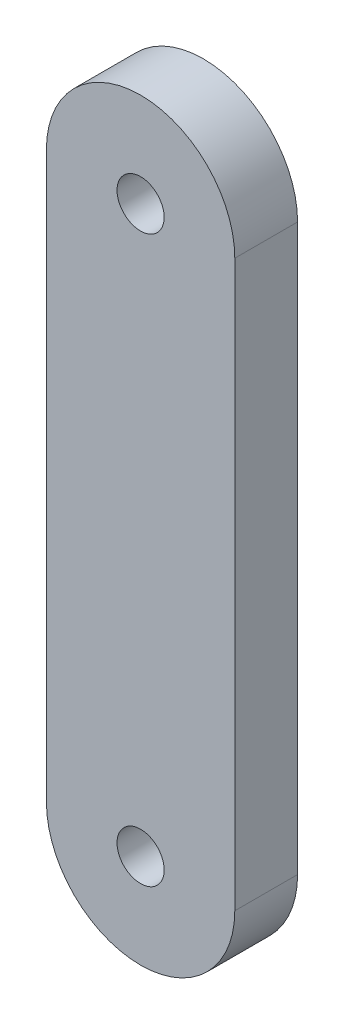
ISO-10303-21;
HEADER;
FILE_DESCRIPTION(('STEP AP214'),'2;1');
FILE_NAME('part.step','',(''),(''),'','','');
FILE_SCHEMA(('AUTOMOTIVE_DESIGN { 1 0 10303 214 1 1 1 1 }'));
ENDSEC;
DATA;
#1=APPLICATION_CONTEXT('core data for automotive mechanical design processes');
#2=APPLICATION_PROTOCOL_DEFINITION('international standard','automotive_design',2000,#1);
#3=PRODUCT_CONTEXT('',#1,'mechanical');
#4=PRODUCT('Part','Part','',(#3));
#5=PRODUCT_RELATED_PRODUCT_CATEGORY('part','',(#4));
#6=PRODUCT_DEFINITION_FORMATION('','',#4);
#7=PRODUCT_DEFINITION_CONTEXT('part definition',#1,'design');
#8=PRODUCT_DEFINITION('design','',#6,#7);
#9=PRODUCT_DEFINITION_SHAPE('','',#8);
#10=(LENGTH_UNIT() NAMED_UNIT(*) SI_UNIT(.MILLI.,.METRE.));
#11=(NAMED_UNIT(*) PLANE_ANGLE_UNIT() SI_UNIT($,.RADIAN.));
#12=(NAMED_UNIT(*) SI_UNIT($,.STERADIAN.) SOLID_ANGLE_UNIT());
#13=UNCERTAINTY_MEASURE_WITH_UNIT(LENGTH_MEASURE(1.E-05),#10,'distance_accuracy_value','');
#14=(GEOMETRIC_REPRESENTATION_CONTEXT(3) GLOBAL_UNCERTAINTY_ASSIGNED_CONTEXT((#13)) GLOBAL_UNIT_ASSIGNED_CONTEXT((#10,
#11,#12)) REPRESENTATION_CONTEXT('',''));
#15=CARTESIAN_POINT('',(0.,0.,0.));
#16=DIRECTION('',(0.,0.,1.));
#17=DIRECTION('',(1.,0.,0.));
#18=AXIS2_PLACEMENT_3D('',#15,#16,#17);
#19=CARTESIAN_POINT('',(0.,-36.,0.));
#20=DIRECTION('',(0.,0.,1.));
#21=DIRECTION('',(1.,0.,0.));
#22=AXIS2_PLACEMENT_3D('',#19,#20,#21);
#23=CYLINDRICAL_SURFACE('',#22,12.);
#24=CARTESIAN_POINT('',(0.,-36.,8.));
#25=DIRECTION('',(0.,0.,1.));
#26=DIRECTION('',(1.,0.,0.));
#27=AXIS2_PLACEMENT_3D('',#24,#25,#26);
#28=CIRCLE('',#27,12.);
#29=CARTESIAN_POINT('',(-12.,-36.,8.));
#30=VERTEX_POINT('',#29);
#31=CARTESIAN_POINT('',(12.,-36.,8.));
#32=VERTEX_POINT('',#31);
#33=EDGE_CURVE('E110',#30,#32,#28,.T.);
#34=ORIENTED_EDGE('',*,*,#33,.F.);
#35=DIRECTION('',(0.,0.,1.));
#36=VECTOR('',#35,1.);
#37=CARTESIAN_POINT('',(-12.,-36.,0.));
#38=LINE('',#37,#36);
#39=CARTESIAN_POINT('',(-12.,-36.,0.));
#40=VERTEX_POINT('',#39);
#41=EDGE_CURVE('E11',#40,#30,#38,.T.);
#42=ORIENTED_EDGE('',*,*,#41,.F.);
#43=CARTESIAN_POINT('',(0.,-36.,0.));
#44=DIRECTION('',(0.,0.,1.));
#45=DIRECTION('',(1.,0.,0.));
#46=AXIS2_PLACEMENT_3D('',#43,#44,#45);
#47=CIRCLE('',#46,12.);
#48=CARTESIAN_POINT('',(12.,-36.,0.));
#49=VERTEX_POINT('',#48);
#50=EDGE_CURVE('E101',#40,#49,#47,.T.);
#51=ORIENTED_EDGE('',*,*,#50,.T.);
#52=DIRECTION('',(0.,0.,1.));
#53=VECTOR('',#52,1.);
#54=CARTESIAN_POINT('',(12.,-36.,0.));
#55=LINE('',#54,#53);
#56=EDGE_CURVE('E42',#49,#32,#55,.T.);
#57=ORIENTED_EDGE('',*,*,#56,.T.);
#58=EDGE_LOOP('',(#34,#42,#51,#57));
#59=FACE_BOUND('',#58,.T.);
#60=ADVANCED_FACE('F39',(#59),#23,.T.);
#61=CARTESIAN_POINT('',(-12.,36.,0.));
#62=DIRECTION('',(-1.,0.,0.));
#63=DIRECTION('',(0.,0.,1.));
#64=AXIS2_PLACEMENT_3D('',#61,#62,#63);
#65=PLANE('',#64);
#66=DIRECTION('',(0.,-1.,0.));
#67=VECTOR('',#66,1.);
#68=CARTESIAN_POINT('',(-12.,36.,8.));
#69=LINE('',#68,#67);
#70=CARTESIAN_POINT('',(-12.,36.,8.));
#71=VERTEX_POINT('',#70);
#72=EDGE_CURVE('E104',#71,#30,#69,.T.);
#73=ORIENTED_EDGE('',*,*,#72,.F.);
#74=DIRECTION('',(0.,0.,1.));
#75=VECTOR('',#74,1.);
#76=CARTESIAN_POINT('',(-12.,36.,0.));
#77=LINE('',#76,#75);
#78=CARTESIAN_POINT('',(-12.,36.,0.));
#79=VERTEX_POINT('',#78);
#80=EDGE_CURVE('E49',#79,#71,#77,.T.);
#81=ORIENTED_EDGE('',*,*,#80,.F.);
#82=DIRECTION('',(0.,-1.,0.));
#83=VECTOR('',#82,1.);
#84=CARTESIAN_POINT('',(-12.,36.,0.));
#85=LINE('',#84,#83);
#86=EDGE_CURVE('E96',#79,#40,#85,.T.);
#87=ORIENTED_EDGE('',*,*,#86,.T.);
#88=ORIENTED_EDGE('',*,*,#41,.T.);
#89=EDGE_LOOP('',(#73,#81,#87,#88));
#90=FACE_BOUND('',#89,.T.);
#91=ADVANCED_FACE('F127',(#90),#65,.T.);
#92=CARTESIAN_POINT('',(0.,36.,0.));
#93=DIRECTION('',(0.,0.,1.));
#94=DIRECTION('',(1.,0.,0.));
#95=AXIS2_PLACEMENT_3D('',#92,#93,#94);
#96=CYLINDRICAL_SURFACE('',#95,12.);
#97=CARTESIAN_POINT('',(0.,36.,8.));
#98=DIRECTION('',(0.,0.,1.));
#99=DIRECTION('',(1.,0.,0.));
#100=AXIS2_PLACEMENT_3D('',#97,#98,#99);
#101=CIRCLE('',#100,12.);
#102=CARTESIAN_POINT('',(12.,36.,8.));
#103=VERTEX_POINT('',#102);
#104=EDGE_CURVE('E90',#103,#71,#101,.T.);
#105=ORIENTED_EDGE('',*,*,#104,.F.);
#106=DIRECTION('',(0.,0.,1.));
#107=VECTOR('',#106,1.);
#108=CARTESIAN_POINT('',(12.,36.,0.));
#109=LINE('',#108,#107);
#110=CARTESIAN_POINT('',(12.,36.,0.));
#111=VERTEX_POINT('',#110);
#112=EDGE_CURVE('E85',#111,#103,#109,.T.);
#113=ORIENTED_EDGE('',*,*,#112,.F.);
#114=CARTESIAN_POINT('',(0.,36.,0.));
#115=DIRECTION('',(0.,0.,1.));
#116=DIRECTION('',(1.,0.,0.));
#117=AXIS2_PLACEMENT_3D('',#114,#115,#116);
#118=CIRCLE('',#117,12.);
#119=EDGE_CURVE('E88',#111,#79,#118,.T.);
#120=ORIENTED_EDGE('',*,*,#119,.T.);
#121=ORIENTED_EDGE('',*,*,#80,.T.);
#122=EDGE_LOOP('',(#105,#113,#120,#121));
#123=FACE_BOUND('',#122,.T.);
#124=ADVANCED_FACE('F87',(#123),#96,.T.);
#125=CARTESIAN_POINT('',(12.,-36.,0.));
#126=DIRECTION('',(1.,0.,0.));
#127=DIRECTION('',(0.,1.,0.));
#128=AXIS2_PLACEMENT_3D('',#125,#126,#127);
#129=PLANE('',#128);
#130=DIRECTION('',(0.,1.,0.));
#131=VECTOR('',#130,1.);
#132=CARTESIAN_POINT('',(12.,-36.,8.));
#133=LINE('',#132,#131);
#134=EDGE_CURVE('E114',#32,#103,#133,.T.);
#135=ORIENTED_EDGE('',*,*,#134,.F.);
#136=ORIENTED_EDGE('',*,*,#56,.F.);
#137=DIRECTION('',(0.,1.,0.));
#138=VECTOR('',#137,1.);
#139=CARTESIAN_POINT('',(12.,-36.,0.));
#140=LINE('',#139,#138);
#141=EDGE_CURVE('E95',#49,#111,#140,.T.);
#142=ORIENTED_EDGE('',*,*,#141,.T.);
#143=ORIENTED_EDGE('',*,*,#112,.T.);
#144=EDGE_LOOP('',(#135,#136,#142,#143));
#145=FACE_BOUND('',#144,.T.);
#146=ADVANCED_FACE('F99',(#145),#129,.T.);
#147=CARTESIAN_POINT('',(0.,-36.,0.));
#148=DIRECTION('',(0.,0.,1.));
#149=DIRECTION('',(1.,0.,0.));
#150=AXIS2_PLACEMENT_3D('',#147,#148,#149);
#151=PLANE('',#150);
#152=CARTESIAN_POINT('',(0.,36.,0.));
#153=DIRECTION('',(0.,0.,1.));
#154=DIRECTION('',(-1.,0.,0.));
#155=AXIS2_PLACEMENT_3D('',#152,#153,#154);
#156=CIRCLE('',#155,3.);
#157=CARTESIAN_POINT('',(-3.,36.,0.));
#158=VERTEX_POINT('',#157);
#159=EDGE_CURVE('E160',#158,#158,#156,.T.);
#160=ORIENTED_EDGE('',*,*,#159,.T.);
#161=EDGE_LOOP('',(#160));
#162=FACE_BOUND('',#161,.T.);
#163=CARTESIAN_POINT('',(0.,-36.,0.));
#164=DIRECTION('',(0.,0.,1.));
#165=DIRECTION('',(-1.,0.,0.));
#166=AXIS2_PLACEMENT_3D('',#163,#164,#165);
#167=CIRCLE('',#166,3.);
#168=CARTESIAN_POINT('',(-3.,-36.,0.));
#169=VERTEX_POINT('',#168);
#170=EDGE_CURVE('E115',#169,#169,#167,.T.);
#171=ORIENTED_EDGE('',*,*,#170,.T.);
#172=EDGE_LOOP('',(#171));
#173=FACE_BOUND('',#172,.T.);
#174=ORIENTED_EDGE('',*,*,#50,.F.);
#175=ORIENTED_EDGE('',*,*,#86,.F.);
#176=ORIENTED_EDGE('',*,*,#119,.F.);
#177=ORIENTED_EDGE('',*,*,#141,.F.);
#178=EDGE_LOOP('',(#174,#175,#176,#177));
#179=FACE_BOUND('',#178,.T.);
#180=ADVANCED_FACE('F94',(#162,#173,#179),#151,.F.);
#181=CARTESIAN_POINT('',(0.,-36.,8.));
#182=DIRECTION('',(0.,0.,1.));
#183=DIRECTION('',(1.,0.,0.));
#184=AXIS2_PLACEMENT_3D('',#181,#182,#183);
#185=PLANE('',#184);
#186=CARTESIAN_POINT('',(0.,36.,8.));
#187=DIRECTION('',(0.,0.,1.));
#188=DIRECTION('',(-1.,0.,0.));
#189=AXIS2_PLACEMENT_3D('',#186,#187,#188);
#190=CIRCLE('',#189,3.);
#191=CARTESIAN_POINT('',(-3.,36.,8.));
#192=VERTEX_POINT('',#191);
#193=EDGE_CURVE('E163',#192,#192,#190,.T.);
#194=ORIENTED_EDGE('',*,*,#193,.F.);
#195=EDGE_LOOP('',(#194));
#196=FACE_BOUND('',#195,.T.);
#197=CARTESIAN_POINT('',(0.,-36.,8.));
#198=DIRECTION('',(0.,0.,1.));
#199=DIRECTION('',(-1.,0.,0.));
#200=AXIS2_PLACEMENT_3D('',#197,#198,#199);
#201=CIRCLE('',#200,3.);
#202=CARTESIAN_POINT('',(-3.,-36.,8.));
#203=VERTEX_POINT('',#202);
#204=EDGE_CURVE('E167',#203,#203,#201,.T.);
#205=ORIENTED_EDGE('',*,*,#204,.F.);
#206=EDGE_LOOP('',(#205));
#207=FACE_BOUND('',#206,.T.);
#208=ORIENTED_EDGE('',*,*,#33,.T.);
#209=ORIENTED_EDGE('',*,*,#134,.T.);
#210=ORIENTED_EDGE('',*,*,#104,.T.);
#211=ORIENTED_EDGE('',*,*,#72,.T.);
#212=EDGE_LOOP('',(#208,#209,#210,#211));
#213=FACE_BOUND('',#212,.T.);
#214=ADVANCED_FACE('F126',(#196,#207,#213),#185,.T.);
#215=CARTESIAN_POINT('',(0.,-36.,0.));
#216=DIRECTION('',(0.,0.,1.));
#217=DIRECTION('',(1.,0.,0.));
#218=AXIS2_PLACEMENT_3D('',#215,#216,#217);
#219=CYLINDRICAL_SURFACE('',#218,3.);
#220=ORIENTED_EDGE('',*,*,#170,.F.);
#221=EDGE_LOOP('',(#220));
#222=FACE_BOUND('',#221,.T.);
#223=ORIENTED_EDGE('',*,*,#204,.T.);
#224=EDGE_LOOP('',(#223));
#225=FACE_BOUND('',#224,.T.);
#226=ADVANCED_FACE('F145',(#222,#225),#219,.F.);
#227=CARTESIAN_POINT('',(0.,36.,0.));
#228=DIRECTION('',(0.,0.,1.));
#229=DIRECTION('',(1.,0.,0.));
#230=AXIS2_PLACEMENT_3D('',#227,#228,#229);
#231=CYLINDRICAL_SURFACE('',#230,3.);
#232=ORIENTED_EDGE('',*,*,#159,.F.);
#233=EDGE_LOOP('',(#232));
#234=FACE_BOUND('',#233,.T.);
#235=ORIENTED_EDGE('',*,*,#193,.T.);
#236=EDGE_LOOP('',(#235));
#237=FACE_BOUND('',#236,.T.);
#238=ADVANCED_FACE('F152',(#234,#237),#231,.F.);
#239=CLOSED_SHELL('',(#60,#91,#124,#146,#180,#214,#226,#238));
#240=MANIFOLD_SOLID_BREP('B2',#239);
#241=ADVANCED_BREP_SHAPE_REPRESENTATION('',(#18,#240),#14);
#242=SHAPE_DEFINITION_REPRESENTATION(#9,#241);
ENDSEC;
END-ISO-10303-21;
